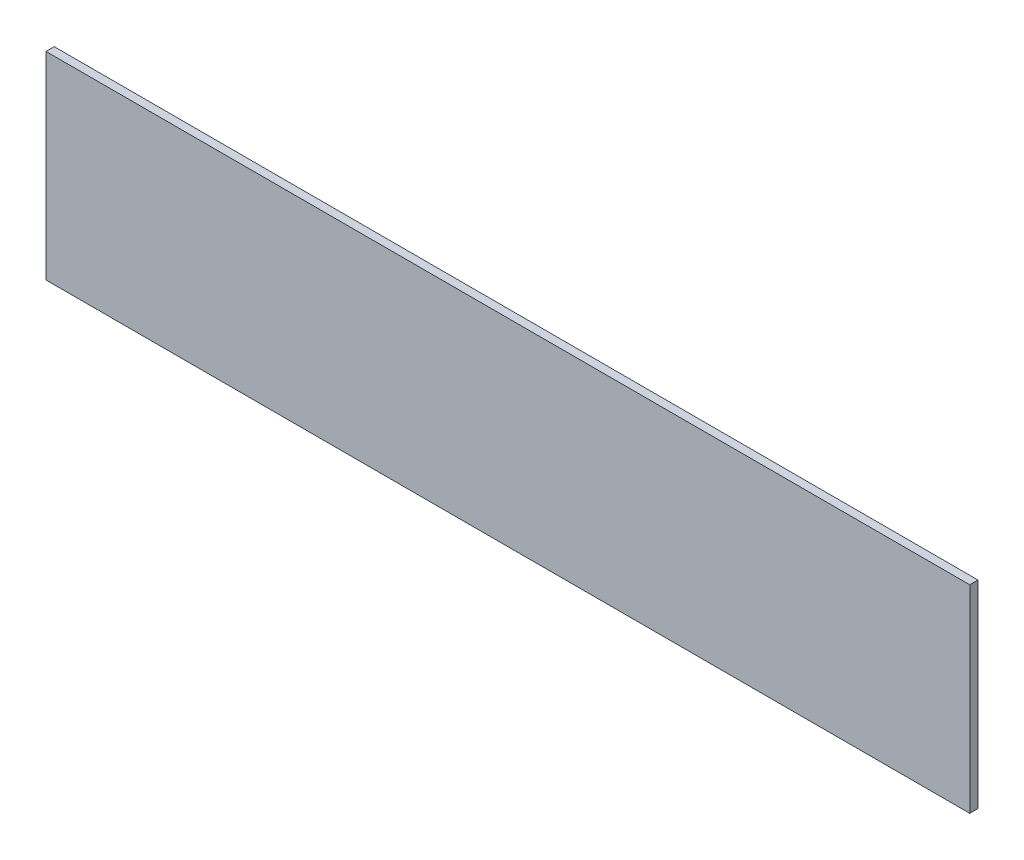
ISO-10303-21;
HEADER;
FILE_DESCRIPTION(('STEP AP214'),'2;1');
FILE_NAME('part.step','',(''),(''),'','','');
FILE_SCHEMA(('AUTOMOTIVE_DESIGN { 1 0 10303 214 1 1 1 1 }'));
ENDSEC;
DATA;
#1=APPLICATION_CONTEXT('core data for automotive mechanical design processes');
#2=APPLICATION_PROTOCOL_DEFINITION('international standard','automotive_design',2000,#1);
#3=PRODUCT_CONTEXT('',#1,'mechanical');
#4=PRODUCT('Part','Part','',(#3));
#5=PRODUCT_RELATED_PRODUCT_CATEGORY('part','',(#4));
#6=PRODUCT_DEFINITION_FORMATION('','',#4);
#7=PRODUCT_DEFINITION_CONTEXT('part definition',#1,'design');
#8=PRODUCT_DEFINITION('design','',#6,#7);
#9=PRODUCT_DEFINITION_SHAPE('','',#8);
#10=(LENGTH_UNIT() NAMED_UNIT(*) SI_UNIT(.MILLI.,.METRE.));
#11=(NAMED_UNIT(*) PLANE_ANGLE_UNIT() SI_UNIT($,.RADIAN.));
#12=(NAMED_UNIT(*) SI_UNIT($,.STERADIAN.) SOLID_ANGLE_UNIT());
#13=UNCERTAINTY_MEASURE_WITH_UNIT(LENGTH_MEASURE(1.E-05),#10,'distance_accuracy_value','');
#14=(GEOMETRIC_REPRESENTATION_CONTEXT(3) GLOBAL_UNCERTAINTY_ASSIGNED_CONTEXT((#13)) GLOBAL_UNIT_ASSIGNED_CONTEXT((#10,
#11,#12)) REPRESENTATION_CONTEXT('',''));
#15=CARTESIAN_POINT('',(0.,0.,0.));
#16=DIRECTION('',(0.,0.,1.));
#17=DIRECTION('',(1.,0.,0.));
#18=AXIS2_PLACEMENT_3D('',#15,#16,#17);
#19=CARTESIAN_POINT('',(0.,0.,1.5875));
#20=DIRECTION('',(1.,0.,0.));
#21=DIRECTION('',(0.,0.,-1.));
#22=AXIS2_PLACEMENT_3D('',#19,#20,#21);
#23=PLANE('',#22);
#24=DIRECTION('',(0.,-1.,0.));
#25=VECTOR('',#24,1.);
#26=CARTESIAN_POINT('',(0.,0.,0.));
#27=LINE('',#26,#25);
#28=CARTESIAN_POINT('',(0.,38.1,0.));
#29=VERTEX_POINT('',#28);
#30=CARTESIAN_POINT('',(0.,0.,0.));
#31=VERTEX_POINT('',#30);
#32=EDGE_CURVE('E96',#29,#31,#27,.T.);
#33=ORIENTED_EDGE('',*,*,#32,.T.);
#34=DIRECTION('',(0.,0.,-1.));
#35=VECTOR('',#34,1.);
#36=CARTESIAN_POINT('',(0.,0.,1.5875));
#37=LINE('',#36,#35);
#38=CARTESIAN_POINT('',(0.,0.,1.5875));
#39=VERTEX_POINT('',#38);
#40=EDGE_CURVE('E11',#39,#31,#37,.T.);
#41=ORIENTED_EDGE('',*,*,#40,.F.);
#42=DIRECTION('',(0.,-1.,0.));
#43=VECTOR('',#42,1.);
#44=CARTESIAN_POINT('',(0.,0.,1.5875));
#45=LINE('',#44,#43);
#46=CARTESIAN_POINT('',(0.,38.1,1.5875));
#47=VERTEX_POINT('',#46);
#48=EDGE_CURVE('E84',#47,#39,#45,.T.);
#49=ORIENTED_EDGE('',*,*,#48,.F.);
#50=DIRECTION('',(0.,0.,-1.));
#51=VECTOR('',#50,1.);
#52=CARTESIAN_POINT('',(0.,38.1,1.5875));
#53=LINE('',#52,#51);
#54=EDGE_CURVE('E92',#47,#29,#53,.T.);
#55=ORIENTED_EDGE('',*,*,#54,.T.);
#56=EDGE_LOOP('',(#33,#41,#49,#55));
#57=FACE_BOUND('',#56,.T.);
#58=ADVANCED_FACE('F33',(#57),#23,.F.);
#59=CARTESIAN_POINT('',(0.,0.,1.5875));
#60=DIRECTION('',(0.,1.,0.));
#61=DIRECTION('',(0.,0.,1.));
#62=AXIS2_PLACEMENT_3D('',#59,#60,#61);
#63=PLANE('',#62);
#64=DIRECTION('',(1.,0.,0.));
#65=VECTOR('',#64,1.);
#66=CARTESIAN_POINT('',(0.,0.,0.));
#67=LINE('',#66,#65);
#68=CARTESIAN_POINT('',(177.8,0.,0.));
#69=VERTEX_POINT('',#68);
#70=EDGE_CURVE('E88',#31,#69,#67,.T.);
#71=ORIENTED_EDGE('',*,*,#70,.T.);
#72=DIRECTION('',(0.,0.,-1.));
#73=VECTOR('',#72,1.);
#74=CARTESIAN_POINT('',(177.8,0.,1.5875));
#75=LINE('',#74,#73);
#76=CARTESIAN_POINT('',(177.8,0.,1.5875));
#77=VERTEX_POINT('',#76);
#78=EDGE_CURVE('E41',#77,#69,#75,.T.);
#79=ORIENTED_EDGE('',*,*,#78,.F.);
#80=DIRECTION('',(1.,0.,0.));
#81=VECTOR('',#80,1.);
#82=CARTESIAN_POINT('',(0.,0.,1.5875));
#83=LINE('',#82,#81);
#84=EDGE_CURVE('E79',#39,#77,#83,.T.);
#85=ORIENTED_EDGE('',*,*,#84,.F.);
#86=ORIENTED_EDGE('',*,*,#40,.T.);
#87=EDGE_LOOP('',(#71,#79,#85,#86));
#88=FACE_BOUND('',#87,.T.);
#89=ADVANCED_FACE('F87',(#88),#63,.F.);
#90=CARTESIAN_POINT('',(177.8,0.,1.5875));
#91=DIRECTION('',(-1.,0.,0.));
#92=DIRECTION('',(0.,0.,1.));
#93=AXIS2_PLACEMENT_3D('',#90,#91,#92);
#94=PLANE('',#93);
#95=DIRECTION('',(0.,1.,0.));
#96=VECTOR('',#95,1.);
#97=CARTESIAN_POINT('',(177.8,0.,0.));
#98=LINE('',#97,#96);
#99=CARTESIAN_POINT('',(177.8,38.1,0.));
#100=VERTEX_POINT('',#99);
#101=EDGE_CURVE('E66',#69,#100,#98,.T.);
#102=ORIENTED_EDGE('',*,*,#101,.T.);
#103=DIRECTION('',(0.,0.,-1.));
#104=VECTOR('',#103,1.);
#105=CARTESIAN_POINT('',(177.8,38.1,1.5875));
#106=LINE('',#105,#104);
#107=CARTESIAN_POINT('',(177.8,38.1,1.5875));
#108=VERTEX_POINT('',#107);
#109=EDGE_CURVE('E89',#108,#100,#106,.T.);
#110=ORIENTED_EDGE('',*,*,#109,.F.);
#111=DIRECTION('',(0.,1.,0.));
#112=VECTOR('',#111,1.);
#113=CARTESIAN_POINT('',(177.8,0.,1.5875));
#114=LINE('',#113,#112);
#115=EDGE_CURVE('E82',#77,#108,#114,.T.);
#116=ORIENTED_EDGE('',*,*,#115,.F.);
#117=ORIENTED_EDGE('',*,*,#78,.T.);
#118=EDGE_LOOP('',(#102,#110,#116,#117));
#119=FACE_BOUND('',#118,.T.);
#120=ADVANCED_FACE('F90',(#119),#94,.F.);
#121=CARTESIAN_POINT('',(0.,38.1,1.5875));
#122=DIRECTION('',(0.,-1.,0.));
#123=DIRECTION('',(0.,0.,-1.));
#124=AXIS2_PLACEMENT_3D('',#121,#122,#123);
#125=PLANE('',#124);
#126=DIRECTION('',(-1.,0.,0.));
#127=VECTOR('',#126,1.);
#128=CARTESIAN_POINT('',(0.,38.1,0.));
#129=LINE('',#128,#127);
#130=EDGE_CURVE('E72',#100,#29,#129,.T.);
#131=ORIENTED_EDGE('',*,*,#130,.T.);
#132=ORIENTED_EDGE('',*,*,#54,.F.);
#133=DIRECTION('',(-1.,0.,0.));
#134=VECTOR('',#133,1.);
#135=CARTESIAN_POINT('',(0.,38.1,1.5875));
#136=LINE('',#135,#134);
#137=EDGE_CURVE('E49',#108,#47,#136,.T.);
#138=ORIENTED_EDGE('',*,*,#137,.F.);
#139=ORIENTED_EDGE('',*,*,#109,.T.);
#140=EDGE_LOOP('',(#131,#132,#138,#139));
#141=FACE_BOUND('',#140,.T.);
#142=ADVANCED_FACE('F103',(#141),#125,.F.);
#143=CARTESIAN_POINT('',(0.,0.,1.5875));
#144=DIRECTION('',(0.,0.,-1.));
#145=DIRECTION('',(-1.,0.,0.));
#146=AXIS2_PLACEMENT_3D('',#143,#144,#145);
#147=PLANE('',#146);
#148=ORIENTED_EDGE('',*,*,#48,.T.);
#149=ORIENTED_EDGE('',*,*,#84,.T.);
#150=ORIENTED_EDGE('',*,*,#115,.T.);
#151=ORIENTED_EDGE('',*,*,#137,.T.);
#152=EDGE_LOOP('',(#148,#149,#150,#151));
#153=FACE_BOUND('',#152,.T.);
#154=ADVANCED_FACE('F80',(#153),#147,.F.);
#155=CARTESIAN_POINT('',(0.,0.,0.));
#156=DIRECTION('',(0.,0.,-1.));
#157=DIRECTION('',(-1.,0.,0.));
#158=AXIS2_PLACEMENT_3D('',#155,#156,#157);
#159=PLANE('',#158);
#160=ORIENTED_EDGE('',*,*,#32,.F.);
#161=ORIENTED_EDGE('',*,*,#130,.F.);
#162=ORIENTED_EDGE('',*,*,#101,.F.);
#163=ORIENTED_EDGE('',*,*,#70,.F.);
#164=EDGE_LOOP('',(#160,#161,#162,#163));
#165=FACE_BOUND('',#164,.T.);
#166=ADVANCED_FACE('F106',(#165),#159,.T.);
#167=CLOSED_SHELL('',(#58,#89,#120,#142,#154,#166));
#168=MANIFOLD_SOLID_BREP('B2',#167);
#169=ADVANCED_BREP_SHAPE_REPRESENTATION('',(#18,#168),#14);
#170=SHAPE_DEFINITION_REPRESENTATION(#9,#169);
ENDSEC;
END-ISO-10303-21;
